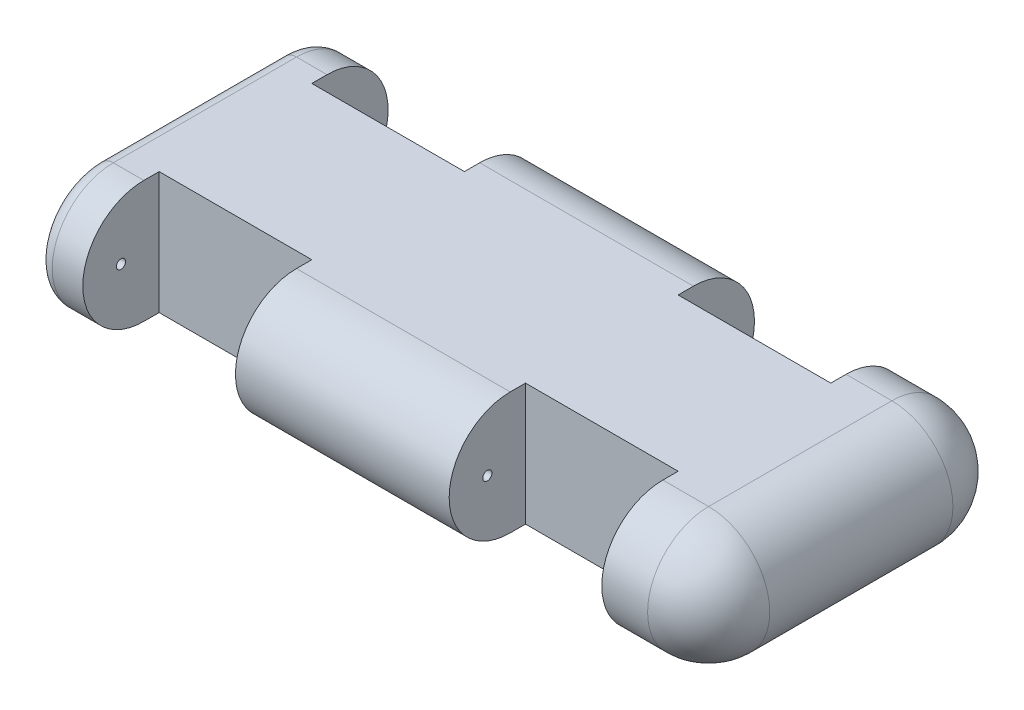
ISO-10303-21;
HEADER;
FILE_DESCRIPTION(('STEP AP214'),'2;1');
FILE_NAME('part.step','',(''),(''),'','','');
FILE_SCHEMA(('AUTOMOTIVE_DESIGN { 1 0 10303 214 1 1 1 1 }'));
ENDSEC;
DATA;
#1=APPLICATION_CONTEXT('core data for automotive mechanical design processes');
#2=APPLICATION_PROTOCOL_DEFINITION('international standard','automotive_design',2000,#1);
#3=PRODUCT_CONTEXT('',#1,'mechanical');
#4=PRODUCT('Part','Part','',(#3));
#5=PRODUCT_RELATED_PRODUCT_CATEGORY('part','',(#4));
#6=PRODUCT_DEFINITION_FORMATION('','',#4);
#7=PRODUCT_DEFINITION_CONTEXT('part definition',#1,'design');
#8=PRODUCT_DEFINITION('design','',#6,#7);
#9=PRODUCT_DEFINITION_SHAPE('','',#8);
#10=(LENGTH_UNIT() NAMED_UNIT(*) SI_UNIT(.MILLI.,.METRE.));
#11=(NAMED_UNIT(*) PLANE_ANGLE_UNIT() SI_UNIT($,.RADIAN.));
#12=(NAMED_UNIT(*) SI_UNIT($,.STERADIAN.) SOLID_ANGLE_UNIT());
#13=UNCERTAINTY_MEASURE_WITH_UNIT(LENGTH_MEASURE(1.E-05),#10,'distance_accuracy_value','');
#14=(GEOMETRIC_REPRESENTATION_CONTEXT(3) GLOBAL_UNCERTAINTY_ASSIGNED_CONTEXT((#13)) GLOBAL_UNIT_ASSIGNED_CONTEXT((#10,
#11,#12)) REPRESENTATION_CONTEXT('',''));
#15=CARTESIAN_POINT('',(0.,0.,0.));
#16=DIRECTION('',(0.,0.,1.));
#17=DIRECTION('',(1.,0.,0.));
#18=AXIS2_PLACEMENT_3D('',#15,#16,#17);
#19=CARTESIAN_POINT('',(-200.,40.,-100.));
#20=DIRECTION('',(1.,0.,0.));
#21=DIRECTION('',(0.,0.,-1.));
#22=AXIS2_PLACEMENT_3D('',#19,#20,#21);
#23=PLANE('',#22);
#24=DIRECTION('',(0.,0.,1.));
#25=VECTOR('',#24,1.);
#26=CARTESIAN_POINT('',(-200.,30.,-60.));
#27=LINE('',#26,#25);
#28=CARTESIAN_POINT('',(-200.,30.,60.));
#29=VERTEX_POINT('',#28);
#30=CARTESIAN_POINT('',(-200.,30.,-60.));
#31=VERTEX_POINT('',#30);
#32=EDGE_CURVE('E279',#29,#31,#27,.F.);
#33=ORIENTED_EDGE('',*,*,#32,.T.);
#34=CARTESIAN_POINT('',(-200.,0.,-60.));
#35=DIRECTION('',(1.,0.,0.));
#36=DIRECTION('',(0.,0.,-1.));
#37=AXIS2_PLACEMENT_3D('',#34,#35,#36);
#38=CIRCLE('',#37,30.);
#39=CARTESIAN_POINT('',(-200.,-30.,-60.));
#40=VERTEX_POINT('',#39);
#41=EDGE_CURVE('E285',#31,#40,#38,.F.);
#42=ORIENTED_EDGE('',*,*,#41,.T.);
#43=DIRECTION('',(0.,0.,1.));
#44=VECTOR('',#43,1.);
#45=CARTESIAN_POINT('',(-200.,-30.,-100.));
#46=LINE('',#45,#44);
#47=CARTESIAN_POINT('',(-200.,-30.,60.));
#48=VERTEX_POINT('',#47);
#49=EDGE_CURVE('E283',#40,#48,#46,.T.);
#50=ORIENTED_EDGE('',*,*,#49,.T.);
#51=CARTESIAN_POINT('',(-200.,0.,60.));
#52=DIRECTION('',(1.,0.,0.));
#53=DIRECTION('',(0.,0.,-1.));
#54=AXIS2_PLACEMENT_3D('',#51,#52,#53);
#55=CIRCLE('',#54,30.);
#56=EDGE_CURVE('E281',#48,#29,#55,.F.);
#57=ORIENTED_EDGE('',*,*,#56,.T.);
#58=EDGE_LOOP('',(#33,#42,#50,#57));
#59=FACE_BOUND('',#58,.T.);
#60=CARTESIAN_POINT('',(-200.,0.,75.));
#61=DIRECTION('',(-1.,0.,0.));
#62=DIRECTION('',(0.,0.,1.));
#63=AXIS2_PLACEMENT_3D('',#60,#61,#62);
#64=CIRCLE('',#63,3.00000000000001);
#65=CARTESIAN_POINT('',(-200.,0.,78.));
#66=VERTEX_POINT('',#65);
#67=EDGE_CURVE('E339',#66,#66,#64,.T.);
#68=ORIENTED_EDGE('',*,*,#67,.F.);
#69=EDGE_LOOP('',(#68));
#70=FACE_BOUND('',#69,.T.);
#71=CARTESIAN_POINT('',(-200.,0.,-75.));
#72=DIRECTION('',(-1.,0.,0.));
#73=DIRECTION('',(0.,0.,1.));
#74=AXIS2_PLACEMENT_3D('',#71,#72,#73);
#75=CIRCLE('',#74,3.00000000000001);
#76=CARTESIAN_POINT('',(-200.,0.,-72.));
#77=VERTEX_POINT('',#76);
#78=EDGE_CURVE('E357',#77,#77,#75,.T.);
#79=ORIENTED_EDGE('',*,*,#78,.F.);
#80=EDGE_LOOP('',(#79));
#81=FACE_BOUND('',#80,.T.);
#82=ADVANCED_FACE('F37',(#59,#70,#81),#23,.F.);
#83=CARTESIAN_POINT('',(-170.,40.,100.));
#84=DIRECTION('',(-1.,0.,0.));
#85=DIRECTION('',(0.,0.,1.));
#86=AXIS2_PLACEMENT_3D('',#83,#84,#85);
#87=PLANE('',#86);
#88=CARTESIAN_POINT('',(-170.,0.,74.9999999999999));
#89=DIRECTION('',(-1.,0.,0.));
#90=DIRECTION('',(0.,0.,1.));
#91=AXIS2_PLACEMENT_3D('',#88,#89,#90);
#92=CIRCLE('',#91,3.00000000000001);
#93=CARTESIAN_POINT('',(-170.,0.,77.9999999999999));
#94=VERTEX_POINT('',#93);
#95=EDGE_CURVE('E354',#94,#94,#92,.T.);
#96=ORIENTED_EDGE('',*,*,#95,.T.);
#97=EDGE_LOOP('',(#96));
#98=FACE_BOUND('',#97,.T.);
#99=DIRECTION('',(0.,0.,-1.));
#100=VECTOR('',#99,1.);
#101=CARTESIAN_POINT('',(-170.,40.,100.));
#102=LINE('',#101,#100);
#103=CARTESIAN_POINT('',(-170.,40.,60.));
#104=VERTEX_POINT('',#103);
#105=CARTESIAN_POINT('',(-170.,40.,50.));
#106=VERTEX_POINT('',#105);
#107=EDGE_CURVE('E239',#104,#106,#102,.T.);
#108=ORIENTED_EDGE('',*,*,#107,.F.);
#109=CARTESIAN_POINT('',(-170.,0.,60.));
#110=DIRECTION('',(-1.,0.,0.));
#111=DIRECTION('',(0.,0.,1.));
#112=AXIS2_PLACEMENT_3D('',#109,#110,#111);
#113=CIRCLE('',#112,40.);
#114=CARTESIAN_POINT('',(-170.,-40.,60.));
#115=VERTEX_POINT('',#114);
#116=EDGE_CURVE('E214',#104,#115,#113,.F.);
#117=ORIENTED_EDGE('',*,*,#116,.T.);
#118=DIRECTION('',(0.,0.,-1.));
#119=VECTOR('',#118,1.);
#120=CARTESIAN_POINT('',(-170.,-40.,100.));
#121=LINE('',#120,#119);
#122=CARTESIAN_POINT('',(-170.,-40.,50.));
#123=VERTEX_POINT('',#122);
#124=EDGE_CURVE('E370',#115,#123,#121,.T.);
#125=ORIENTED_EDGE('',*,*,#124,.T.);
#126=DIRECTION('',(0.,-1.,0.));
#127=VECTOR('',#126,1.);
#128=CARTESIAN_POINT('',(-170.,40.,50.));
#129=LINE('',#128,#127);
#130=EDGE_CURVE('E262',#106,#123,#129,.T.);
#131=ORIENTED_EDGE('',*,*,#130,.F.);
#132=EDGE_LOOP('',(#108,#117,#125,#131));
#133=FACE_BOUND('',#132,.T.);
#134=ADVANCED_FACE('F438',(#98,#133),#87,.F.);
#135=CARTESIAN_POINT('',(-70.,40.,100.));
#136=DIRECTION('',(1.,0.,0.));
#137=DIRECTION('',(0.,0.,-1.));
#138=AXIS2_PLACEMENT_3D('',#135,#136,#137);
#139=PLANE('',#138);
#140=CARTESIAN_POINT('',(-70.,0.,74.9999999999998));
#141=DIRECTION('',(1.,0.,0.));
#142=DIRECTION('',(0.,0.,-1.));
#143=AXIS2_PLACEMENT_3D('',#140,#141,#142);
#144=CIRCLE('',#143,3.00000000000001);
#145=CARTESIAN_POINT('',(-70.,0.,71.9999999999998));
#146=VERTEX_POINT('',#145);
#147=EDGE_CURVE('E351',#146,#146,#144,.T.);
#148=ORIENTED_EDGE('',*,*,#147,.T.);
#149=EDGE_LOOP('',(#148));
#150=FACE_BOUND('',#149,.T.);
#151=DIRECTION('',(0.,0.,1.));
#152=VECTOR('',#151,1.);
#153=CARTESIAN_POINT('',(-70.,-40.,100.));
#154=LINE('',#153,#152);
#155=CARTESIAN_POINT('',(-70.,-40.,50.));
#156=VERTEX_POINT('',#155);
#157=CARTESIAN_POINT('',(-70.,-40.,60.));
#158=VERTEX_POINT('',#157);
#159=EDGE_CURVE('E401',#156,#158,#154,.T.);
#160=ORIENTED_EDGE('',*,*,#159,.T.);
#161=CARTESIAN_POINT('',(-70.,0.,60.));
#162=DIRECTION('',(1.,0.,0.));
#163=DIRECTION('',(0.,0.,-1.));
#164=AXIS2_PLACEMENT_3D('',#161,#162,#163);
#165=CIRCLE('',#164,40.);
#166=CARTESIAN_POINT('',(-69.9999999999999,40.,60.));
#167=VERTEX_POINT('',#166);
#168=EDGE_CURVE('E432',#158,#167,#165,.F.);
#169=ORIENTED_EDGE('',*,*,#168,.T.);
#170=DIRECTION('',(0.,0.,1.));
#171=VECTOR('',#170,1.);
#172=CARTESIAN_POINT('',(-70.,40.,100.));
#173=LINE('',#172,#171);
#174=CARTESIAN_POINT('',(-70.,40.,50.));
#175=VERTEX_POINT('',#174);
#176=EDGE_CURVE('E374',#175,#167,#173,.T.);
#177=ORIENTED_EDGE('',*,*,#176,.F.);
#178=DIRECTION('',(0.,-1.,0.));
#179=VECTOR('',#178,1.);
#180=CARTESIAN_POINT('',(-70.,40.,50.));
#181=LINE('',#180,#179);
#182=EDGE_CURVE('E259',#175,#156,#181,.T.);
#183=ORIENTED_EDGE('',*,*,#182,.T.);
#184=EDGE_LOOP('',(#160,#169,#177,#183));
#185=FACE_BOUND('',#184,.T.);
#186=ADVANCED_FACE('F449',(#150,#185),#139,.F.);
#187=CARTESIAN_POINT('',(70.,40.,100.));
#188=DIRECTION('',(-1.,0.,0.));
#189=DIRECTION('',(0.,0.,1.));
#190=AXIS2_PLACEMENT_3D('',#187,#188,#189);
#191=PLANE('',#190);
#192=CARTESIAN_POINT('',(70.,0.,74.9999999999996));
#193=DIRECTION('',(-1.,0.,0.));
#194=DIRECTION('',(0.,0.,1.));
#195=AXIS2_PLACEMENT_3D('',#192,#193,#194);
#196=CIRCLE('',#195,3.00000000000001);
#197=CARTESIAN_POINT('',(70.,0.,77.9999999999996));
#198=VERTEX_POINT('',#197);
#199=EDGE_CURVE('E348',#198,#198,#196,.T.);
#200=ORIENTED_EDGE('',*,*,#199,.T.);
#201=EDGE_LOOP('',(#200));
#202=FACE_BOUND('',#201,.T.);
#203=DIRECTION('',(0.,0.,-1.));
#204=VECTOR('',#203,1.);
#205=CARTESIAN_POINT('',(70.,40.,100.));
#206=LINE('',#205,#204);
#207=CARTESIAN_POINT('',(70.0000000000001,40.,60.));
#208=VERTEX_POINT('',#207);
#209=CARTESIAN_POINT('',(70.,40.,50.));
#210=VERTEX_POINT('',#209);
#211=EDGE_CURVE('E377',#208,#210,#206,.T.);
#212=ORIENTED_EDGE('',*,*,#211,.F.);
#213=CARTESIAN_POINT('',(70.,0.,60.));
#214=DIRECTION('',(-1.,0.,0.));
#215=DIRECTION('',(0.,0.,1.));
#216=AXIS2_PLACEMENT_3D('',#213,#214,#215);
#217=CIRCLE('',#216,40.);
#218=CARTESIAN_POINT('',(70.0000000000001,-40.,60.));
#219=VERTEX_POINT('',#218);
#220=EDGE_CURVE('E429',#208,#219,#217,.F.);
#221=ORIENTED_EDGE('',*,*,#220,.T.);
#222=DIRECTION('',(0.,0.,-1.));
#223=VECTOR('',#222,1.);
#224=CARTESIAN_POINT('',(70.,-40.,100.));
#225=LINE('',#224,#223);
#226=CARTESIAN_POINT('',(70.,-40.,50.));
#227=VERTEX_POINT('',#226);
#228=EDGE_CURVE('E404',#219,#227,#225,.T.);
#229=ORIENTED_EDGE('',*,*,#228,.T.);
#230=DIRECTION('',(0.,-1.,0.));
#231=VECTOR('',#230,1.);
#232=CARTESIAN_POINT('',(70.,40.,50.));
#233=LINE('',#232,#231);
#234=EDGE_CURVE('E256',#210,#227,#233,.T.);
#235=ORIENTED_EDGE('',*,*,#234,.F.);
#236=EDGE_LOOP('',(#212,#221,#229,#235));
#237=FACE_BOUND('',#236,.T.);
#238=ADVANCED_FACE('F608',(#202,#237),#191,.F.);
#239=CARTESIAN_POINT('',(170.,40.,100.));
#240=DIRECTION('',(1.,0.,0.));
#241=DIRECTION('',(0.,0.,-1.));
#242=AXIS2_PLACEMENT_3D('',#239,#240,#241);
#243=PLANE('',#242);
#244=CARTESIAN_POINT('',(170.,0.,74.9999999999995));
#245=DIRECTION('',(1.,0.,0.));
#246=DIRECTION('',(0.,0.,-1.));
#247=AXIS2_PLACEMENT_3D('',#244,#245,#246);
#248=CIRCLE('',#247,3.00000000000001);
#249=CARTESIAN_POINT('',(170.,0.,71.9999999999995));
#250=VERTEX_POINT('',#249);
#251=EDGE_CURVE('E345',#250,#250,#248,.T.);
#252=ORIENTED_EDGE('',*,*,#251,.T.);
#253=EDGE_LOOP('',(#252));
#254=FACE_BOUND('',#253,.T.);
#255=DIRECTION('',(0.,0.,1.));
#256=VECTOR('',#255,1.);
#257=CARTESIAN_POINT('',(170.,-40.,100.));
#258=LINE('',#257,#256);
#259=CARTESIAN_POINT('',(170.,-40.,50.));
#260=VERTEX_POINT('',#259);
#261=CARTESIAN_POINT('',(170.,-40.,60.));
#262=VERTEX_POINT('',#261);
#263=EDGE_CURVE('E219',#260,#262,#258,.T.);
#264=ORIENTED_EDGE('',*,*,#263,.T.);
#265=CARTESIAN_POINT('',(170.,0.,60.));
#266=DIRECTION('',(1.,0.,0.));
#267=DIRECTION('',(0.,0.,-1.));
#268=AXIS2_PLACEMENT_3D('',#265,#266,#267);
#269=CIRCLE('',#268,40.);
#270=CARTESIAN_POINT('',(170.,40.,60.));
#271=VERTEX_POINT('',#270);
#272=EDGE_CURVE('E427',#262,#271,#269,.F.);
#273=ORIENTED_EDGE('',*,*,#272,.T.);
#274=DIRECTION('',(0.,0.,1.));
#275=VECTOR('',#274,1.);
#276=CARTESIAN_POINT('',(170.,40.,100.));
#277=LINE('',#276,#275);
#278=CARTESIAN_POINT('',(170.,40.,50.));
#279=VERTEX_POINT('',#278);
#280=EDGE_CURVE('E381',#279,#271,#277,.T.);
#281=ORIENTED_EDGE('',*,*,#280,.F.);
#282=DIRECTION('',(0.,-1.,0.));
#283=VECTOR('',#282,1.);
#284=CARTESIAN_POINT('',(170.,40.,50.));
#285=LINE('',#284,#283);
#286=EDGE_CURVE('E253',#279,#260,#285,.T.);
#287=ORIENTED_EDGE('',*,*,#286,.T.);
#288=EDGE_LOOP('',(#264,#273,#281,#287));
#289=FACE_BOUND('',#288,.T.);
#290=ADVANCED_FACE('F415',(#254,#289),#243,.F.);
#291=CARTESIAN_POINT('',(170.,40.,-100.));
#292=DIRECTION('',(1.,0.,0.));
#293=DIRECTION('',(0.,0.,-1.));
#294=AXIS2_PLACEMENT_3D('',#291,#292,#293);
#295=PLANE('',#294);
#296=CARTESIAN_POINT('',(170.,0.,-74.9999999999995));
#297=DIRECTION('',(1.,0.,0.));
#298=DIRECTION('',(0.,0.,-1.));
#299=AXIS2_PLACEMENT_3D('',#296,#297,#298);
#300=CIRCLE('',#299,3.00000000000001);
#301=CARTESIAN_POINT('',(170.,0.,-77.9999999999995));
#302=VERTEX_POINT('',#301);
#303=EDGE_CURVE('E367',#302,#302,#300,.T.);
#304=ORIENTED_EDGE('',*,*,#303,.T.);
#305=EDGE_LOOP('',(#304));
#306=FACE_BOUND('',#305,.T.);
#307=CARTESIAN_POINT('',(170.,0.,-60.));
#308=DIRECTION('',(1.,0.,0.));
#309=DIRECTION('',(0.,0.,-1.));
#310=AXIS2_PLACEMENT_3D('',#307,#308,#309);
#311=CIRCLE('',#310,40.);
#312=CARTESIAN_POINT('',(170.,40.,-60.));
#313=VERTEX_POINT('',#312);
#314=CARTESIAN_POINT('',(170.,-40.,-60.));
#315=VERTEX_POINT('',#314);
#316=EDGE_CURVE('E337',#313,#315,#311,.F.);
#317=ORIENTED_EDGE('',*,*,#316,.T.);
#318=DIRECTION('',(0.,0.,1.));
#319=VECTOR('',#318,1.);
#320=CARTESIAN_POINT('',(170.,-40.,-100.));
#321=LINE('',#320,#319);
#322=CARTESIAN_POINT('',(170.,-40.,-50.));
#323=VERTEX_POINT('',#322);
#324=EDGE_CURVE('E206',#315,#323,#321,.T.);
#325=ORIENTED_EDGE('',*,*,#324,.T.);
#326=DIRECTION('',(0.,-1.,0.));
#327=VECTOR('',#326,1.);
#328=CARTESIAN_POINT('',(170.,40.,-50.));
#329=LINE('',#328,#327);
#330=CARTESIAN_POINT('',(170.,40.,-50.));
#331=VERTEX_POINT('',#330);
#332=EDGE_CURVE('E250',#331,#323,#329,.T.);
#333=ORIENTED_EDGE('',*,*,#332,.F.);
#334=DIRECTION('',(0.,0.,1.));
#335=VECTOR('',#334,1.);
#336=CARTESIAN_POINT('',(170.,40.,-100.));
#337=LINE('',#336,#335);
#338=EDGE_CURVE('E386',#313,#331,#337,.T.);
#339=ORIENTED_EDGE('',*,*,#338,.F.);
#340=EDGE_LOOP('',(#317,#325,#333,#339));
#341=FACE_BOUND('',#340,.T.);
#342=ADVANCED_FACE('F607',(#306,#341),#295,.F.);
#343=CARTESIAN_POINT('',(70.,40.,-100.));
#344=DIRECTION('',(-1.,0.,0.));
#345=DIRECTION('',(0.,0.,1.));
#346=AXIS2_PLACEMENT_3D('',#343,#344,#345);
#347=PLANE('',#346);
#348=CARTESIAN_POINT('',(70.,0.,-74.9999999999996));
#349=DIRECTION('',(-1.,0.,0.));
#350=DIRECTION('',(0.,0.,1.));
#351=AXIS2_PLACEMENT_3D('',#348,#349,#350);
#352=CIRCLE('',#351,3.00000000000001);
#353=CARTESIAN_POINT('',(70.,0.,-71.9999999999996));
#354=VERTEX_POINT('',#353);
#355=EDGE_CURVE('E364',#354,#354,#352,.T.);
#356=ORIENTED_EDGE('',*,*,#355,.T.);
#357=EDGE_LOOP('',(#356));
#358=FACE_BOUND('',#357,.T.);
#359=DIRECTION('',(0.,0.,-1.));
#360=VECTOR('',#359,1.);
#361=CARTESIAN_POINT('',(70.,-40.,-100.));
#362=LINE('',#361,#360);
#363=CARTESIAN_POINT('',(70.,-40.,-50.));
#364=VERTEX_POINT('',#363);
#365=CARTESIAN_POINT('',(70.,-40.,-60.));
#366=VERTEX_POINT('',#365);
#367=EDGE_CURVE('E229',#364,#366,#362,.T.);
#368=ORIENTED_EDGE('',*,*,#367,.T.);
#369=CARTESIAN_POINT('',(70.,0.,-60.));
#370=DIRECTION('',(-1.,0.,0.));
#371=DIRECTION('',(0.,0.,1.));
#372=AXIS2_PLACEMENT_3D('',#369,#370,#371);
#373=CIRCLE('',#372,40.);
#374=CARTESIAN_POINT('',(70.0000000000001,40.,-60.));
#375=VERTEX_POINT('',#374);
#376=EDGE_CURVE('E333',#366,#375,#373,.F.);
#377=ORIENTED_EDGE('',*,*,#376,.T.);
#378=DIRECTION('',(0.,0.,-1.));
#379=VECTOR('',#378,1.);
#380=CARTESIAN_POINT('',(70.,40.,-100.));
#381=LINE('',#380,#379);
#382=CARTESIAN_POINT('',(70.,40.,-50.));
#383=VERTEX_POINT('',#382);
#384=EDGE_CURVE('E390',#383,#375,#381,.T.);
#385=ORIENTED_EDGE('',*,*,#384,.F.);
#386=DIRECTION('',(0.,-1.,0.));
#387=VECTOR('',#386,1.);
#388=CARTESIAN_POINT('',(70.,40.,-50.));
#389=LINE('',#388,#387);
#390=EDGE_CURVE('E247',#383,#364,#389,.T.);
#391=ORIENTED_EDGE('',*,*,#390,.T.);
#392=EDGE_LOOP('',(#368,#377,#385,#391));
#393=FACE_BOUND('',#392,.T.);
#394=ADVANCED_FACE('F663',(#358,#393),#347,.F.);
#395=CARTESIAN_POINT('',(-70.,40.,-100.));
#396=DIRECTION('',(1.,0.,0.));
#397=DIRECTION('',(0.,0.,-1.));
#398=AXIS2_PLACEMENT_3D('',#395,#396,#397);
#399=PLANE('',#398);
#400=CARTESIAN_POINT('',(-70.,0.,-74.9999999999998));
#401=DIRECTION('',(1.,0.,0.));
#402=DIRECTION('',(0.,0.,-1.));
#403=AXIS2_PLACEMENT_3D('',#400,#401,#402);
#404=CIRCLE('',#403,3.00000000000001);
#405=CARTESIAN_POINT('',(-70.,0.,-77.9999999999998));
#406=VERTEX_POINT('',#405);
#407=EDGE_CURVE('E269',#406,#406,#404,.T.);
#408=ORIENTED_EDGE('',*,*,#407,.T.);
#409=EDGE_LOOP('',(#408));
#410=FACE_BOUND('',#409,.T.);
#411=DIRECTION('',(0.,0.,1.));
#412=VECTOR('',#411,1.);
#413=CARTESIAN_POINT('',(-70.,40.,-100.));
#414=LINE('',#413,#412);
#415=CARTESIAN_POINT('',(-69.9999999999998,40.,-60.));
#416=VERTEX_POINT('',#415);
#417=CARTESIAN_POINT('',(-70.,40.,-50.));
#418=VERTEX_POINT('',#417);
#419=EDGE_CURVE('E393',#416,#418,#414,.T.);
#420=ORIENTED_EDGE('',*,*,#419,.F.);
#421=CARTESIAN_POINT('',(-70.,0.,-60.));
#422=DIRECTION('',(1.,0.,0.));
#423=DIRECTION('',(0.,0.,-1.));
#424=AXIS2_PLACEMENT_3D('',#421,#422,#423);
#425=CIRCLE('',#424,40.);
#426=CARTESIAN_POINT('',(-69.9999999999999,-40.,-60.));
#427=VERTEX_POINT('',#426);
#428=EDGE_CURVE('E329',#416,#427,#425,.F.);
#429=ORIENTED_EDGE('',*,*,#428,.T.);
#430=DIRECTION('',(0.,0.,1.));
#431=VECTOR('',#430,1.);
#432=CARTESIAN_POINT('',(-70.,-40.,-100.));
#433=LINE('',#432,#431);
#434=CARTESIAN_POINT('',(-70.,-40.,-50.));
#435=VERTEX_POINT('',#434);
#436=EDGE_CURVE('E232',#427,#435,#433,.T.);
#437=ORIENTED_EDGE('',*,*,#436,.T.);
#438=DIRECTION('',(0.,-1.,0.));
#439=VECTOR('',#438,1.);
#440=CARTESIAN_POINT('',(-70.,40.,-50.));
#441=LINE('',#440,#439);
#442=EDGE_CURVE('E243',#418,#435,#441,.T.);
#443=ORIENTED_EDGE('',*,*,#442,.F.);
#444=EDGE_LOOP('',(#420,#429,#437,#443));
#445=FACE_BOUND('',#444,.T.);
#446=ADVANCED_FACE('F651',(#410,#445),#399,.F.);
#447=CARTESIAN_POINT('',(-170.,40.,-100.));
#448=DIRECTION('',(-1.,0.,0.));
#449=DIRECTION('',(0.,0.,1.));
#450=AXIS2_PLACEMENT_3D('',#447,#448,#449);
#451=PLANE('',#450);
#452=CARTESIAN_POINT('',(-170.,0.,-74.9999999999999));
#453=DIRECTION('',(-1.,0.,0.));
#454=DIRECTION('',(0.,0.,1.));
#455=AXIS2_PLACEMENT_3D('',#452,#453,#454);
#456=CIRCLE('',#455,3.00000000000001);
#457=CARTESIAN_POINT('',(-170.,0.,-71.9999999999999));
#458=VERTEX_POINT('',#457);
#459=EDGE_CURVE('E266',#458,#458,#456,.T.);
#460=ORIENTED_EDGE('',*,*,#459,.T.);
#461=EDGE_LOOP('',(#460));
#462=FACE_BOUND('',#461,.T.);
#463=DIRECTION('',(0.,0.,-1.));
#464=VECTOR('',#463,1.);
#465=CARTESIAN_POINT('',(-170.,-40.,-100.));
#466=LINE('',#465,#464);
#467=CARTESIAN_POINT('',(-170.,-40.,-50.));
#468=VERTEX_POINT('',#467);
#469=CARTESIAN_POINT('',(-170.,-40.,-60.));
#470=VERTEX_POINT('',#469);
#471=EDGE_CURVE('E236',#468,#470,#466,.T.);
#472=ORIENTED_EDGE('',*,*,#471,.T.);
#473=CARTESIAN_POINT('',(-170.,0.,-60.));
#474=DIRECTION('',(-1.,0.,0.));
#475=DIRECTION('',(0.,0.,1.));
#476=AXIS2_PLACEMENT_3D('',#473,#474,#475);
#477=CIRCLE('',#476,40.);
#478=CARTESIAN_POINT('',(-170.,40.,-60.));
#479=VERTEX_POINT('',#478);
#480=EDGE_CURVE('E327',#470,#479,#477,.F.);
#481=ORIENTED_EDGE('',*,*,#480,.T.);
#482=DIRECTION('',(0.,0.,-1.));
#483=VECTOR('',#482,1.);
#484=CARTESIAN_POINT('',(-170.,40.,-100.));
#485=LINE('',#484,#483);
#486=CARTESIAN_POINT('',(-170.,40.,-50.));
#487=VERTEX_POINT('',#486);
#488=EDGE_CURVE('E244',#487,#479,#485,.T.);
#489=ORIENTED_EDGE('',*,*,#488,.F.);
#490=DIRECTION('',(0.,-1.,0.));
#491=VECTOR('',#490,1.);
#492=CARTESIAN_POINT('',(-170.,40.,-50.));
#493=LINE('',#492,#491);
#494=EDGE_CURVE('E240',#487,#468,#493,.T.);
#495=ORIENTED_EDGE('',*,*,#494,.T.);
#496=EDGE_LOOP('',(#472,#481,#489,#495));
#497=FACE_BOUND('',#496,.T.);
#498=ADVANCED_FACE('F646',(#462,#497),#451,.F.);
#499=CARTESIAN_POINT('',(-170.,40.,50.));
#500=DIRECTION('',(0.,0.,-1.));
#501=DIRECTION('',(-1.,0.,0.));
#502=AXIS2_PLACEMENT_3D('',#499,#500,#501);
#503=PLANE('',#502);
#504=DIRECTION('',(1.,0.,0.));
#505=VECTOR('',#504,1.);
#506=CARTESIAN_POINT('',(-170.,-40.,50.));
#507=LINE('',#506,#505);
#508=EDGE_CURVE('E399',#123,#156,#507,.T.);
#509=ORIENTED_EDGE('',*,*,#508,.T.);
#510=ORIENTED_EDGE('',*,*,#182,.F.);
#511=DIRECTION('',(1.,0.,0.));
#512=VECTOR('',#511,1.);
#513=CARTESIAN_POINT('',(-170.,40.,50.));
#514=LINE('',#513,#512);
#515=EDGE_CURVE('E372',#106,#175,#514,.T.);
#516=ORIENTED_EDGE('',*,*,#515,.F.);
#517=ORIENTED_EDGE('',*,*,#130,.T.);
#518=EDGE_LOOP('',(#509,#510,#516,#517));
#519=FACE_BOUND('',#518,.T.);
#520=ADVANCED_FACE('F445',(#519),#503,.F.);
#521=CARTESIAN_POINT('',(70.,40.,50.));
#522=DIRECTION('',(0.,0.,-1.));
#523=DIRECTION('',(-1.,0.,0.));
#524=AXIS2_PLACEMENT_3D('',#521,#522,#523);
#525=PLANE('',#524);
#526=DIRECTION('',(1.,0.,0.));
#527=VECTOR('',#526,1.);
#528=CARTESIAN_POINT('',(70.,-40.,50.));
#529=LINE('',#528,#527);
#530=EDGE_CURVE('E224',#227,#260,#529,.T.);
#531=ORIENTED_EDGE('',*,*,#530,.T.);
#532=ORIENTED_EDGE('',*,*,#286,.F.);
#533=DIRECTION('',(1.,0.,0.));
#534=VECTOR('',#533,1.);
#535=CARTESIAN_POINT('',(70.,40.,50.));
#536=LINE('',#535,#534);
#537=EDGE_CURVE('E379',#210,#279,#536,.T.);
#538=ORIENTED_EDGE('',*,*,#537,.F.);
#539=ORIENTED_EDGE('',*,*,#234,.T.);
#540=EDGE_LOOP('',(#531,#532,#538,#539));
#541=FACE_BOUND('',#540,.T.);
#542=ADVANCED_FACE('F408',(#541),#525,.F.);
#543=CARTESIAN_POINT('',(70.,40.,-50.));
#544=DIRECTION('',(0.,0.,1.));
#545=DIRECTION('',(1.,0.,0.));
#546=AXIS2_PLACEMENT_3D('',#543,#544,#545);
#547=PLANE('',#546);
#548=DIRECTION('',(-1.,0.,0.));
#549=VECTOR('',#548,1.);
#550=CARTESIAN_POINT('',(70.,-40.,-50.));
#551=LINE('',#550,#549);
#552=EDGE_CURVE('E221',#323,#364,#551,.T.);
#553=ORIENTED_EDGE('',*,*,#552,.T.);
#554=ORIENTED_EDGE('',*,*,#390,.F.);
#555=DIRECTION('',(-1.,0.,0.));
#556=VECTOR('',#555,1.);
#557=CARTESIAN_POINT('',(70.,40.,-50.));
#558=LINE('',#557,#556);
#559=EDGE_CURVE('E388',#331,#383,#558,.T.);
#560=ORIENTED_EDGE('',*,*,#559,.F.);
#561=ORIENTED_EDGE('',*,*,#332,.T.);
#562=EDGE_LOOP('',(#553,#554,#560,#561));
#563=FACE_BOUND('',#562,.T.);
#564=ADVANCED_FACE('F740',(#563),#547,.F.);
#565=CARTESIAN_POINT('',(-170.,40.,-50.));
#566=DIRECTION('',(0.,0.,1.));
#567=DIRECTION('',(1.,0.,0.));
#568=AXIS2_PLACEMENT_3D('',#565,#566,#567);
#569=PLANE('',#568);
#570=DIRECTION('',(-1.,0.,0.));
#571=VECTOR('',#570,1.);
#572=CARTESIAN_POINT('',(-170.,-40.,-50.));
#573=LINE('',#572,#571);
#574=EDGE_CURVE('E234',#435,#468,#573,.T.);
#575=ORIENTED_EDGE('',*,*,#574,.T.);
#576=ORIENTED_EDGE('',*,*,#494,.F.);
#577=DIRECTION('',(-1.,0.,0.));
#578=VECTOR('',#577,1.);
#579=CARTESIAN_POINT('',(-170.,40.,-50.));
#580=LINE('',#579,#578);
#581=EDGE_CURVE('E395',#418,#487,#580,.T.);
#582=ORIENTED_EDGE('',*,*,#581,.F.);
#583=ORIENTED_EDGE('',*,*,#442,.T.);
#584=EDGE_LOOP('',(#575,#576,#582,#583));
#585=FACE_BOUND('',#584,.T.);
#586=ADVANCED_FACE('F539',(#585),#569,.F.);
#587=CARTESIAN_POINT('',(0.,40.,0.));
#588=DIRECTION('',(0.,1.,0.));
#589=DIRECTION('',(0.,0.,1.));
#590=AXIS2_PLACEMENT_3D('',#587,#588,#589);
#591=PLANE('',#590);
#592=DIRECTION('',(-1.,0.,0.));
#593=VECTOR('',#592,1.);
#594=CARTESIAN_POINT('',(200.,40.,-60.));
#595=LINE('',#594,#593);
#596=CARTESIAN_POINT('',(-190.,40.,-60.));
#597=VERTEX_POINT('',#596);
#598=EDGE_CURVE('E208',#479,#597,#595,.T.);
#599=ORIENTED_EDGE('',*,*,#598,.T.);
#600=DIRECTION('',(0.,0.,1.));
#601=VECTOR('',#600,1.);
#602=CARTESIAN_POINT('',(-190.,40.,60.));
#603=LINE('',#602,#601);
#604=CARTESIAN_POINT('',(-190.,40.,60.));
#605=VERTEX_POINT('',#604);
#606=EDGE_CURVE('E11',#597,#605,#603,.T.);
#607=ORIENTED_EDGE('',*,*,#606,.T.);
#608=DIRECTION('',(-1.,0.,0.));
#609=VECTOR('',#608,1.);
#610=CARTESIAN_POINT('',(200.,40.,60.));
#611=LINE('',#610,#609);
#612=EDGE_CURVE('E419',#104,#605,#611,.T.);
#613=ORIENTED_EDGE('',*,*,#612,.F.);
#614=ORIENTED_EDGE('',*,*,#107,.T.);
#615=ORIENTED_EDGE('',*,*,#515,.T.);
#616=ORIENTED_EDGE('',*,*,#176,.T.);
#617=EDGE_CURVE('E422',#208,#167,#611,.T.);
#618=ORIENTED_EDGE('',*,*,#617,.F.);
#619=ORIENTED_EDGE('',*,*,#211,.T.);
#620=ORIENTED_EDGE('',*,*,#537,.T.);
#621=ORIENTED_EDGE('',*,*,#280,.T.);
#622=CARTESIAN_POINT('',(200.,40.,60.));
#623=VERTEX_POINT('',#622);
#624=EDGE_CURVE('E424',#623,#271,#611,.T.);
#625=ORIENTED_EDGE('',*,*,#624,.F.);
#626=DIRECTION('',(0.,0.,-1.));
#627=VECTOR('',#626,1.);
#628=CARTESIAN_POINT('',(200.,40.,-100.));
#629=LINE('',#628,#627);
#630=CARTESIAN_POINT('',(200.,40.,-60.));
#631=VERTEX_POINT('',#630);
#632=EDGE_CURVE('E384',#623,#631,#629,.T.);
#633=ORIENTED_EDGE('',*,*,#632,.T.);
#634=EDGE_CURVE('E213',#631,#313,#595,.T.);
#635=ORIENTED_EDGE('',*,*,#634,.T.);
#636=ORIENTED_EDGE('',*,*,#338,.T.);
#637=ORIENTED_EDGE('',*,*,#559,.T.);
#638=ORIENTED_EDGE('',*,*,#384,.T.);
#639=EDGE_CURVE('E324',#375,#416,#595,.T.);
#640=ORIENTED_EDGE('',*,*,#639,.T.);
#641=ORIENTED_EDGE('',*,*,#419,.T.);
#642=ORIENTED_EDGE('',*,*,#581,.T.);
#643=ORIENTED_EDGE('',*,*,#488,.T.);
#644=EDGE_LOOP('',(#599,#607,#613,#614,#615,#616,#618,#619,#620,#621,#625,#633,#635,#636,#637,
#638,#640,#641,#642,#643));
#645=FACE_BOUND('',#644,.T.);
#646=ADVANCED_FACE('F322',(#645),#591,.T.);
#647=CARTESIAN_POINT('',(0.,-40.,0.));
#648=DIRECTION('',(0.,1.,0.));
#649=DIRECTION('',(0.,0.,1.));
#650=AXIS2_PLACEMENT_3D('',#647,#648,#649);
#651=PLANE('',#650);
#652=DIRECTION('',(-1.,0.,0.));
#653=VECTOR('',#652,1.);
#654=CARTESIAN_POINT('',(0.,-40.,60.));
#655=LINE('',#654,#653);
#656=CARTESIAN_POINT('',(-190.,-40.,60.));
#657=VERTEX_POINT('',#656);
#658=EDGE_CURVE('E273',#115,#657,#655,.T.);
#659=ORIENTED_EDGE('',*,*,#658,.T.);
#660=DIRECTION('',(0.,0.,1.));
#661=VECTOR('',#660,1.);
#662=CARTESIAN_POINT('',(-190.,-40.,0.));
#663=LINE('',#662,#661);
#664=CARTESIAN_POINT('',(-190.,-40.,-60.));
#665=VERTEX_POINT('',#664);
#666=EDGE_CURVE('E288',#657,#665,#663,.F.);
#667=ORIENTED_EDGE('',*,*,#666,.T.);
#668=DIRECTION('',(1.,0.,0.));
#669=VECTOR('',#668,1.);
#670=CARTESIAN_POINT('',(0.,-40.,-60.));
#671=LINE('',#670,#669);
#672=EDGE_CURVE('E271',#665,#470,#671,.T.);
#673=ORIENTED_EDGE('',*,*,#672,.T.);
#674=ORIENTED_EDGE('',*,*,#471,.F.);
#675=ORIENTED_EDGE('',*,*,#574,.F.);
#676=ORIENTED_EDGE('',*,*,#436,.F.);
#677=EDGE_CURVE('E265',#427,#366,#671,.T.);
#678=ORIENTED_EDGE('',*,*,#677,.T.);
#679=ORIENTED_EDGE('',*,*,#367,.F.);
#680=ORIENTED_EDGE('',*,*,#552,.F.);
#681=ORIENTED_EDGE('',*,*,#324,.F.);
#682=DIRECTION('',(-1.,0.,0.));
#683=VECTOR('',#682,1.);
#684=CARTESIAN_POINT('',(200.,-40.,-60.));
#685=LINE('',#684,#683);
#686=CARTESIAN_POINT('',(200.,-40.,-60.));
#687=VERTEX_POINT('',#686);
#688=EDGE_CURVE('E200',#687,#315,#685,.T.);
#689=ORIENTED_EDGE('',*,*,#688,.F.);
#690=DIRECTION('',(0.,0.,-1.));
#691=VECTOR('',#690,1.);
#692=CARTESIAN_POINT('',(200.,-40.,-100.));
#693=LINE('',#692,#691);
#694=CARTESIAN_POINT('',(200.,-40.,60.));
#695=VERTEX_POINT('',#694);
#696=EDGE_CURVE('E203',#695,#687,#693,.T.);
#697=ORIENTED_EDGE('',*,*,#696,.F.);
#698=DIRECTION('',(-1.,0.,0.));
#699=VECTOR('',#698,1.);
#700=CARTESIAN_POINT('',(200.,-40.,60.));
#701=LINE('',#700,#699);
#702=EDGE_CURVE('E416',#695,#262,#701,.T.);
#703=ORIENTED_EDGE('',*,*,#702,.T.);
#704=ORIENTED_EDGE('',*,*,#263,.F.);
#705=ORIENTED_EDGE('',*,*,#530,.F.);
#706=ORIENTED_EDGE('',*,*,#228,.F.);
#707=EDGE_CURVE('E275',#219,#158,#655,.T.);
#708=ORIENTED_EDGE('',*,*,#707,.T.);
#709=ORIENTED_EDGE('',*,*,#159,.F.);
#710=ORIENTED_EDGE('',*,*,#508,.F.);
#711=ORIENTED_EDGE('',*,*,#124,.F.);
#712=EDGE_LOOP('',(#659,#667,#673,#674,#675,#676,#678,#679,#680,#681,#689,#697,#703,#704,#705,
#706,#708,#709,#710,#711));
#713=FACE_BOUND('',#712,.T.);
#714=ADVANCED_FACE('F201',(#713),#651,.F.);
#715=CARTESIAN_POINT('',(200.,0.,-74.9999999999994));
#716=DIRECTION('',(-1.,0.,0.));
#717=DIRECTION('',(0.,0.,1.));
#718=AXIS2_PLACEMENT_3D('',#715,#716,#717);
#719=CYLINDRICAL_SURFACE('',#718,3.00000000000001);
#720=ORIENTED_EDGE('',*,*,#78,.T.);
#721=EDGE_LOOP('',(#720));
#722=FACE_BOUND('',#721,.T.);
#723=ORIENTED_EDGE('',*,*,#459,.F.);
#724=EDGE_LOOP('',(#723));
#725=FACE_BOUND('',#724,.T.);
#726=ADVANCED_FACE('F550',(#722,#725),#719,.F.);
#727=ORIENTED_EDGE('',*,*,#407,.F.);
#728=EDGE_LOOP('',(#727));
#729=FACE_BOUND('',#728,.T.);
#730=ORIENTED_EDGE('',*,*,#355,.F.);
#731=EDGE_LOOP('',(#730));
#732=FACE_BOUND('',#731,.T.);
#733=ADVANCED_FACE('F718',(#729,#732),#719,.F.);
#734=CARTESIAN_POINT('',(200.,0.,-74.9999999999994));
#735=DIRECTION('',(-1.,0.,0.));
#736=DIRECTION('',(0.,0.,1.));
#737=AXIS2_PLACEMENT_3D('',#734,#735,#736);
#738=CIRCLE('',#737,3.00000000000001);
#739=CARTESIAN_POINT('',(200.,0.,-71.9999999999994));
#740=VERTEX_POINT('',#739);
#741=EDGE_CURVE('E270',#740,#740,#738,.T.);
#742=ORIENTED_EDGE('',*,*,#741,.F.);
#743=EDGE_LOOP('',(#742));
#744=FACE_BOUND('',#743,.T.);
#745=ORIENTED_EDGE('',*,*,#303,.F.);
#746=EDGE_LOOP('',(#745));
#747=FACE_BOUND('',#746,.T.);
#748=ADVANCED_FACE('F709',(#744,#747),#719,.F.);
#749=CARTESIAN_POINT('',(200.,0.,74.9999999999994));
#750=DIRECTION('',(-1.,0.,0.));
#751=DIRECTION('',(0.,0.,1.));
#752=AXIS2_PLACEMENT_3D('',#749,#750,#751);
#753=CYLINDRICAL_SURFACE('',#752,3.00000000000001);
#754=CARTESIAN_POINT('',(200.,0.,74.9999999999994));
#755=DIRECTION('',(-1.,0.,0.));
#756=DIRECTION('',(0.,0.,1.));
#757=AXIS2_PLACEMENT_3D('',#754,#755,#756);
#758=CIRCLE('',#757,3.00000000000001);
#759=CARTESIAN_POINT('',(200.,0.,77.9999999999994));
#760=VERTEX_POINT('',#759);
#761=EDGE_CURVE('E342',#760,#760,#758,.T.);
#762=ORIENTED_EDGE('',*,*,#761,.F.);
#763=EDGE_LOOP('',(#762));
#764=FACE_BOUND('',#763,.T.);
#765=ORIENTED_EDGE('',*,*,#251,.F.);
#766=EDGE_LOOP('',(#765));
#767=FACE_BOUND('',#766,.T.);
#768=ADVANCED_FACE('F693',(#764,#767),#753,.F.);
#769=ORIENTED_EDGE('',*,*,#199,.F.);
#770=EDGE_LOOP('',(#769));
#771=FACE_BOUND('',#770,.T.);
#772=ORIENTED_EDGE('',*,*,#147,.F.);
#773=EDGE_LOOP('',(#772));
#774=FACE_BOUND('',#773,.T.);
#775=ADVANCED_FACE('F690',(#771,#774),#753,.F.);
#776=ORIENTED_EDGE('',*,*,#67,.T.);
#777=EDGE_LOOP('',(#776));
#778=FACE_BOUND('',#777,.T.);
#779=ORIENTED_EDGE('',*,*,#95,.F.);
#780=EDGE_LOOP('',(#779));
#781=FACE_BOUND('',#780,.T.);
#782=ADVANCED_FACE('F686',(#778,#781),#753,.F.);
#783=CARTESIAN_POINT('',(200.,0.,-60.));
#784=DIRECTION('',(-1.,0.,0.));
#785=DIRECTION('',(0.,0.,1.));
#786=AXIS2_PLACEMENT_3D('',#783,#784,#785);
#787=CYLINDRICAL_SURFACE('',#786,40.);
#788=ORIENTED_EDGE('',*,*,#316,.F.);
#789=ORIENTED_EDGE('',*,*,#634,.F.);
#790=CARTESIAN_POINT('',(200.,0.,-60.));
#791=DIRECTION('',(1.,0.,0.));
#792=DIRECTION('',(0.,0.,1.));
#793=AXIS2_PLACEMENT_3D('',#790,#791,#792);
#794=CIRCLE('',#793,40.);
#795=EDGE_CURVE('E190',#687,#631,#794,.T.);
#796=ORIENTED_EDGE('',*,*,#795,.F.);
#797=ORIENTED_EDGE('',*,*,#688,.T.);
#798=EDGE_LOOP('',(#788,#789,#796,#797));
#799=FACE_BOUND('',#798,.T.);
#800=ADVANCED_FACE('F211',(#799),#787,.T.);
#801=ORIENTED_EDGE('',*,*,#677,.F.);
#802=ORIENTED_EDGE('',*,*,#428,.F.);
#803=ORIENTED_EDGE('',*,*,#639,.F.);
#804=ORIENTED_EDGE('',*,*,#376,.F.);
#805=EDGE_LOOP('',(#801,#802,#803,#804));
#806=FACE_BOUND('',#805,.T.);
#807=ADVANCED_FACE('F463',(#806),#787,.T.);
#808=ORIENTED_EDGE('',*,*,#672,.F.);
#809=CARTESIAN_POINT('',(-190.,0.,-60.));
#810=DIRECTION('',(1.,0.,0.));
#811=DIRECTION('',(0.,0.,-1.));
#812=AXIS2_PLACEMENT_3D('',#809,#810,#811);
#813=CIRCLE('',#812,40.);
#814=EDGE_CURVE('E276',#665,#597,#813,.T.);
#815=ORIENTED_EDGE('',*,*,#814,.T.);
#816=ORIENTED_EDGE('',*,*,#598,.F.);
#817=ORIENTED_EDGE('',*,*,#480,.F.);
#818=EDGE_LOOP('',(#808,#815,#816,#817));
#819=FACE_BOUND('',#818,.T.);
#820=ADVANCED_FACE('F319',(#819),#787,.T.);
#821=CARTESIAN_POINT('',(200.,0.,60.));
#822=DIRECTION('',(-1.,0.,0.));
#823=DIRECTION('',(0.,0.,1.));
#824=AXIS2_PLACEMENT_3D('',#821,#822,#823);
#825=CYLINDRICAL_SURFACE('',#824,40.);
#826=ORIENTED_EDGE('',*,*,#612,.T.);
#827=CARTESIAN_POINT('',(-190.,0.,60.));
#828=DIRECTION('',(1.,0.,0.));
#829=DIRECTION('',(0.,0.,-1.));
#830=AXIS2_PLACEMENT_3D('',#827,#828,#829);
#831=CIRCLE('',#830,40.);
#832=EDGE_CURVE('E46',#605,#657,#831,.T.);
#833=ORIENTED_EDGE('',*,*,#832,.T.);
#834=ORIENTED_EDGE('',*,*,#658,.F.);
#835=ORIENTED_EDGE('',*,*,#116,.F.);
#836=EDGE_LOOP('',(#826,#833,#834,#835));
#837=FACE_BOUND('',#836,.T.);
#838=ADVANCED_FACE('F453',(#837),#825,.T.);
#839=ORIENTED_EDGE('',*,*,#707,.F.);
#840=ORIENTED_EDGE('',*,*,#220,.F.);
#841=ORIENTED_EDGE('',*,*,#617,.T.);
#842=ORIENTED_EDGE('',*,*,#168,.F.);
#843=EDGE_LOOP('',(#839,#840,#841,#842));
#844=FACE_BOUND('',#843,.T.);
#845=ADVANCED_FACE('F455',(#844),#825,.T.);
#846=ORIENTED_EDGE('',*,*,#702,.F.);
#847=CARTESIAN_POINT('',(200.,0.,60.));
#848=DIRECTION('',(1.,0.,0.));
#849=DIRECTION('',(0.,0.,1.));
#850=AXIS2_PLACEMENT_3D('',#847,#848,#849);
#851=CIRCLE('',#850,40.);
#852=EDGE_CURVE('E420',#623,#695,#851,.T.);
#853=ORIENTED_EDGE('',*,*,#852,.F.);
#854=ORIENTED_EDGE('',*,*,#624,.T.);
#855=ORIENTED_EDGE('',*,*,#272,.F.);
#856=EDGE_LOOP('',(#846,#853,#854,#855));
#857=FACE_BOUND('',#856,.T.);
#858=ADVANCED_FACE('F457',(#857),#825,.T.);
#859=CARTESIAN_POINT('',(200.,0.,60.));
#860=DIRECTION('',(0.,0.,-1.));
#861=DIRECTION('',(-1.,0.,0.));
#862=AXIS2_PLACEMENT_3D('',#859,#860,#861);
#863=CYLINDRICAL_SURFACE('',#862,40.);
#864=CARTESIAN_POINT('',(200.,0.,-60.));
#865=DIRECTION('',(0.,0.,1.));
#866=DIRECTION('',(1.,0.,0.));
#867=AXIS2_PLACEMENT_3D('',#864,#865,#866);
#868=CIRCLE('',#867,40.);
#869=EDGE_CURVE('E186',#687,#631,#868,.T.);
#870=ORIENTED_EDGE('',*,*,#869,.T.);
#871=ORIENTED_EDGE('',*,*,#632,.F.);
#872=CARTESIAN_POINT('',(200.,0.,60.));
#873=DIRECTION('',(0.,0.,1.));
#874=DIRECTION('',(1.,0.,0.));
#875=AXIS2_PLACEMENT_3D('',#872,#873,#874);
#876=CIRCLE('',#875,40.);
#877=EDGE_CURVE('E194',#695,#623,#876,.T.);
#878=ORIENTED_EDGE('',*,*,#877,.F.);
#879=ORIENTED_EDGE('',*,*,#696,.T.);
#880=EDGE_LOOP('',(#870,#871,#878,#879));
#881=FACE_BOUND('',#880,.T.);
#882=ADVANCED_FACE('F216',(#881),#863,.T.);
#883=CARTESIAN_POINT('',(200.,0.,60.));
#884=DIRECTION('',(0.,1.,0.));
#885=DIRECTION('',(0.,0.,-1.));
#886=AXIS2_PLACEMENT_3D('',#883,#884,#885);
#887=SPHERICAL_SURFACE('',#886,40.);
#888=ORIENTED_EDGE('',*,*,#877,.T.);
#889=ORIENTED_EDGE('',*,*,#852,.T.);
#890=EDGE_LOOP('',(#888,#889));
#891=FACE_BOUND('',#890,.T.);
#892=ADVANCED_FACE('F497',(#891),#887,.T.);
#893=CARTESIAN_POINT('',(200.,0.,60.));
#894=DIRECTION('',(-1.,0.,0.));
#895=DIRECTION('',(0.,0.,1.));
#896=AXIS2_PLACEMENT_3D('',#893,#894,#895);
#897=PLANE('',#896);
#898=ORIENTED_EDGE('',*,*,#761,.T.);
#899=EDGE_LOOP('',(#898));
#900=FACE_BOUND('',#899,.T.);
#901=ADVANCED_FACE('F492',(#900),#897,.T.);
#902=CARTESIAN_POINT('',(200.,0.,-60.));
#903=DIRECTION('',(0.,1.,0.));
#904=DIRECTION('',(0.,0.,1.));
#905=AXIS2_PLACEMENT_3D('',#902,#903,#904);
#906=SPHERICAL_SURFACE('',#905,40.);
#907=ORIENTED_EDGE('',*,*,#869,.F.);
#908=ORIENTED_EDGE('',*,*,#795,.T.);
#909=EDGE_LOOP('',(#907,#908));
#910=FACE_BOUND('',#909,.T.);
#911=ADVANCED_FACE('F188',(#910),#906,.T.);
#912=CARTESIAN_POINT('',(200.,0.,-60.));
#913=DIRECTION('',(-1.,0.,0.));
#914=DIRECTION('',(0.,0.,-1.));
#915=AXIS2_PLACEMENT_3D('',#912,#913,#914);
#916=PLANE('',#915);
#917=ORIENTED_EDGE('',*,*,#741,.T.);
#918=EDGE_LOOP('',(#917));
#919=FACE_BOUND('',#918,.T.);
#920=ADVANCED_FACE('F483',(#919),#916,.T.);
#921=CARTESIAN_POINT('',(-190.,0.,60.));
#922=DIRECTION('',(1.,0.,0.));
#923=DIRECTION('',(0.,0.,-1.));
#924=AXIS2_PLACEMENT_3D('',#921,#922,#923);
#925=TOROIDAL_SURFACE('',#924,30.,10.);
#926=CARTESIAN_POINT('',(-190.,30.,60.));
#927=DIRECTION('',(0.,0.,-1.));
#928=DIRECTION('',(-1.,0.,0.));
#929=AXIS2_PLACEMENT_3D('',#926,#927,#928);
#930=CIRCLE('',#929,10.);
#931=EDGE_CURVE('E294',#29,#605,#930,.T.);
#932=ORIENTED_EDGE('',*,*,#931,.F.);
#933=ORIENTED_EDGE('',*,*,#56,.F.);
#934=CARTESIAN_POINT('',(-190.,-30.,60.));
#935=DIRECTION('',(0.,0.,-1.));
#936=DIRECTION('',(-1.,0.,0.));
#937=AXIS2_PLACEMENT_3D('',#934,#935,#936);
#938=CIRCLE('',#937,10.);
#939=EDGE_CURVE('E41',#657,#48,#938,.T.);
#940=ORIENTED_EDGE('',*,*,#939,.F.);
#941=ORIENTED_EDGE('',*,*,#832,.F.);
#942=EDGE_LOOP('',(#932,#933,#940,#941));
#943=FACE_BOUND('',#942,.T.);
#944=ADVANCED_FACE('F39',(#943),#925,.T.);
#945=CARTESIAN_POINT('',(-190.,-30.,-100.));
#946=DIRECTION('',(0.,0.,1.));
#947=DIRECTION('',(1.,0.,0.));
#948=AXIS2_PLACEMENT_3D('',#945,#946,#947);
#949=CYLINDRICAL_SURFACE('',#948,10.);
#950=ORIENTED_EDGE('',*,*,#939,.T.);
#951=ORIENTED_EDGE('',*,*,#49,.F.);
#952=CARTESIAN_POINT('',(-190.,-30.,-60.));
#953=DIRECTION('',(0.,0.,-1.));
#954=DIRECTION('',(-1.,0.,0.));
#955=AXIS2_PLACEMENT_3D('',#952,#953,#954);
#956=CIRCLE('',#955,10.);
#957=EDGE_CURVE('E293',#665,#40,#956,.T.);
#958=ORIENTED_EDGE('',*,*,#957,.F.);
#959=ORIENTED_EDGE('',*,*,#666,.F.);
#960=EDGE_LOOP('',(#950,#951,#958,#959));
#961=FACE_BOUND('',#960,.T.);
#962=ADVANCED_FACE('F304',(#961),#949,.T.);
#963=CARTESIAN_POINT('',(-190.,30.,0.));
#964=DIRECTION('',(0.,0.,-1.));
#965=DIRECTION('',(-1.,0.,0.));
#966=AXIS2_PLACEMENT_3D('',#963,#964,#965);
#967=CYLINDRICAL_SURFACE('',#966,10.);
#968=ORIENTED_EDGE('',*,*,#931,.T.);
#969=ORIENTED_EDGE('',*,*,#606,.F.);
#970=CARTESIAN_POINT('',(-190.,30.,-60.));
#971=DIRECTION('',(0.,0.,-1.));
#972=DIRECTION('',(-1.,0.,0.));
#973=AXIS2_PLACEMENT_3D('',#970,#971,#972);
#974=CIRCLE('',#973,10.);
#975=EDGE_CURVE('E291',#31,#597,#974,.T.);
#976=ORIENTED_EDGE('',*,*,#975,.F.);
#977=ORIENTED_EDGE('',*,*,#32,.F.);
#978=EDGE_LOOP('',(#968,#969,#976,#977));
#979=FACE_BOUND('',#978,.T.);
#980=ADVANCED_FACE('F315',(#979),#967,.T.);
#981=CARTESIAN_POINT('',(-190.,0.,-60.));
#982=DIRECTION('',(1.,0.,0.));
#983=DIRECTION('',(0.,0.,-1.));
#984=AXIS2_PLACEMENT_3D('',#981,#982,#983);
#985=TOROIDAL_SURFACE('',#984,30.,10.);
#986=ORIENTED_EDGE('',*,*,#957,.T.);
#987=ORIENTED_EDGE('',*,*,#41,.F.);
#988=ORIENTED_EDGE('',*,*,#975,.T.);
#989=ORIENTED_EDGE('',*,*,#814,.F.);
#990=EDGE_LOOP('',(#986,#987,#988,#989));
#991=FACE_BOUND('',#990,.T.);
#992=ADVANCED_FACE('F313',(#991),#985,.T.);
#993=CLOSED_SHELL('',(#82,#134,#186,#238,#290,#342,#394,#446,#498,#520,#542,#564,#586,#646,#714,
#726,#733,#748,#768,#775,#782,#800,#807,#820,#838,#845,#858,#882,#892,#901,#911,#920,#944,#962,
#980,#992));
#994=MANIFOLD_SOLID_BREP('B2',#993);
#995=ADVANCED_BREP_SHAPE_REPRESENTATION('',(#18,#994),#14);
#996=SHAPE_DEFINITION_REPRESENTATION(#9,#995);
ENDSEC;
END-ISO-10303-21;
